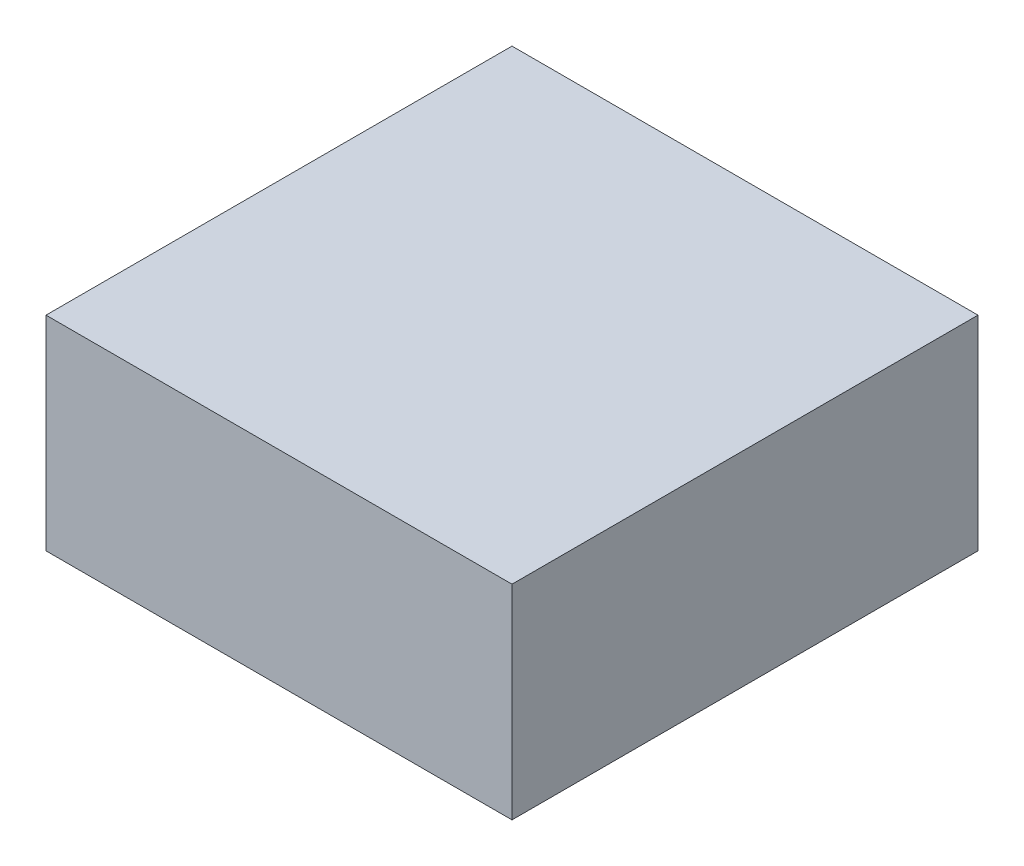
ISO-10303-21;
HEADER;
FILE_DESCRIPTION(('STEP AP214'),'2;1');
FILE_NAME('part.step','',(''),(''),'','','');
FILE_SCHEMA(('AUTOMOTIVE_DESIGN { 1 0 10303 214 1 1 1 1 }'));
ENDSEC;
DATA;
#1=APPLICATION_CONTEXT('core data for automotive mechanical design processes');
#2=APPLICATION_PROTOCOL_DEFINITION('international standard','automotive_design',2000,#1);
#3=PRODUCT_CONTEXT('',#1,'mechanical');
#4=PRODUCT('Part','Part','',(#3));
#5=PRODUCT_RELATED_PRODUCT_CATEGORY('part','',(#4));
#6=PRODUCT_DEFINITION_FORMATION('','',#4);
#7=PRODUCT_DEFINITION_CONTEXT('part definition',#1,'design');
#8=PRODUCT_DEFINITION('design','',#6,#7);
#9=PRODUCT_DEFINITION_SHAPE('','',#8);
#10=(LENGTH_UNIT() NAMED_UNIT(*) SI_UNIT(.MILLI.,.METRE.));
#11=(NAMED_UNIT(*) PLANE_ANGLE_UNIT() SI_UNIT($,.RADIAN.));
#12=(NAMED_UNIT(*) SI_UNIT($,.STERADIAN.) SOLID_ANGLE_UNIT());
#13=UNCERTAINTY_MEASURE_WITH_UNIT(LENGTH_MEASURE(1.E-05),#10,'distance_accuracy_value','');
#14=(GEOMETRIC_REPRESENTATION_CONTEXT(3) GLOBAL_UNCERTAINTY_ASSIGNED_CONTEXT((#13)) GLOBAL_UNIT_ASSIGNED_CONTEXT((#10,
#11,#12)) REPRESENTATION_CONTEXT('',''));
#15=CARTESIAN_POINT('',(0.,0.,0.));
#16=DIRECTION('',(0.,0.,1.));
#17=DIRECTION('',(1.,0.,0.));
#18=AXIS2_PLACEMENT_3D('',#15,#16,#17);
#19=CARTESIAN_POINT('',(105.,92.,-105.));
#20=DIRECTION('',(-1.,0.,0.));
#21=DIRECTION('',(0.,0.,1.));
#22=AXIS2_PLACEMENT_3D('',#19,#20,#21);
#23=PLANE('',#22);
#24=DIRECTION('',(0.,0.,-1.));
#25=VECTOR('',#24,1.);
#26=CARTESIAN_POINT('',(105.,0.,-105.));
#27=LINE('',#26,#25);
#28=CARTESIAN_POINT('',(105.,0.,105.));
#29=VERTEX_POINT('',#28);
#30=CARTESIAN_POINT('',(105.,0.,-105.));
#31=VERTEX_POINT('',#30);
#32=EDGE_CURVE('E96',#29,#31,#27,.T.);
#33=ORIENTED_EDGE('',*,*,#32,.T.);
#34=DIRECTION('',(0.,-1.,0.));
#35=VECTOR('',#34,1.);
#36=CARTESIAN_POINT('',(105.,92.,-105.));
#37=LINE('',#36,#35);
#38=CARTESIAN_POINT('',(105.,92.,-105.));
#39=VERTEX_POINT('',#38);
#40=EDGE_CURVE('E11',#39,#31,#37,.T.);
#41=ORIENTED_EDGE('',*,*,#40,.F.);
#42=DIRECTION('',(0.,0.,-1.));
#43=VECTOR('',#42,1.);
#44=CARTESIAN_POINT('',(105.,92.,-105.));
#45=LINE('',#44,#43);
#46=CARTESIAN_POINT('',(105.,92.,105.));
#47=VERTEX_POINT('',#46);
#48=EDGE_CURVE('E84',#47,#39,#45,.T.);
#49=ORIENTED_EDGE('',*,*,#48,.F.);
#50=DIRECTION('',(0.,-1.,0.));
#51=VECTOR('',#50,1.);
#52=CARTESIAN_POINT('',(105.,92.,105.));
#53=LINE('',#52,#51);
#54=EDGE_CURVE('E92',#47,#29,#53,.T.);
#55=ORIENTED_EDGE('',*,*,#54,.T.);
#56=EDGE_LOOP('',(#33,#41,#49,#55));
#57=FACE_BOUND('',#56,.T.);
#58=ADVANCED_FACE('F33',(#57),#23,.F.);
#59=CARTESIAN_POINT('',(-105.,92.,-105.));
#60=DIRECTION('',(0.,0.,1.));
#61=DIRECTION('',(1.,0.,0.));
#62=AXIS2_PLACEMENT_3D('',#59,#60,#61);
#63=PLANE('',#62);
#64=DIRECTION('',(-1.,0.,0.));
#65=VECTOR('',#64,1.);
#66=CARTESIAN_POINT('',(-105.,0.,-105.));
#67=LINE('',#66,#65);
#68=CARTESIAN_POINT('',(-105.,0.,-105.));
#69=VERTEX_POINT('',#68);
#70=EDGE_CURVE('E88',#31,#69,#67,.T.);
#71=ORIENTED_EDGE('',*,*,#70,.T.);
#72=DIRECTION('',(0.,-1.,0.));
#73=VECTOR('',#72,1.);
#74=CARTESIAN_POINT('',(-105.,92.,-105.));
#75=LINE('',#74,#73);
#76=CARTESIAN_POINT('',(-105.,92.,-105.));
#77=VERTEX_POINT('',#76);
#78=EDGE_CURVE('E41',#77,#69,#75,.T.);
#79=ORIENTED_EDGE('',*,*,#78,.F.);
#80=DIRECTION('',(-1.,0.,0.));
#81=VECTOR('',#80,1.);
#82=CARTESIAN_POINT('',(-105.,92.,-105.));
#83=LINE('',#82,#81);
#84=EDGE_CURVE('E79',#39,#77,#83,.T.);
#85=ORIENTED_EDGE('',*,*,#84,.F.);
#86=ORIENTED_EDGE('',*,*,#40,.T.);
#87=EDGE_LOOP('',(#71,#79,#85,#86));
#88=FACE_BOUND('',#87,.T.);
#89=ADVANCED_FACE('F87',(#88),#63,.F.);
#90=CARTESIAN_POINT('',(-105.,92.,-105.));
#91=DIRECTION('',(1.,0.,0.));
#92=DIRECTION('',(0.,0.,-1.));
#93=AXIS2_PLACEMENT_3D('',#90,#91,#92);
#94=PLANE('',#93);
#95=DIRECTION('',(0.,0.,1.));
#96=VECTOR('',#95,1.);
#97=CARTESIAN_POINT('',(-105.,0.,-105.));
#98=LINE('',#97,#96);
#99=CARTESIAN_POINT('',(-105.,0.,105.));
#100=VERTEX_POINT('',#99);
#101=EDGE_CURVE('E66',#69,#100,#98,.T.);
#102=ORIENTED_EDGE('',*,*,#101,.T.);
#103=DIRECTION('',(0.,-1.,0.));
#104=VECTOR('',#103,1.);
#105=CARTESIAN_POINT('',(-105.,92.,105.));
#106=LINE('',#105,#104);
#107=CARTESIAN_POINT('',(-105.,92.,105.));
#108=VERTEX_POINT('',#107);
#109=EDGE_CURVE('E89',#108,#100,#106,.T.);
#110=ORIENTED_EDGE('',*,*,#109,.F.);
#111=DIRECTION('',(0.,0.,1.));
#112=VECTOR('',#111,1.);
#113=CARTESIAN_POINT('',(-105.,92.,-105.));
#114=LINE('',#113,#112);
#115=EDGE_CURVE('E82',#77,#108,#114,.T.);
#116=ORIENTED_EDGE('',*,*,#115,.F.);
#117=ORIENTED_EDGE('',*,*,#78,.T.);
#118=EDGE_LOOP('',(#102,#110,#116,#117));
#119=FACE_BOUND('',#118,.T.);
#120=ADVANCED_FACE('F90',(#119),#94,.F.);
#121=CARTESIAN_POINT('',(-105.,92.,105.));
#122=DIRECTION('',(0.,0.,-1.));
#123=DIRECTION('',(-1.,0.,0.));
#124=AXIS2_PLACEMENT_3D('',#121,#122,#123);
#125=PLANE('',#124);
#126=DIRECTION('',(1.,0.,0.));
#127=VECTOR('',#126,1.);
#128=CARTESIAN_POINT('',(-105.,0.,105.));
#129=LINE('',#128,#127);
#130=EDGE_CURVE('E72',#100,#29,#129,.T.);
#131=ORIENTED_EDGE('',*,*,#130,.T.);
#132=ORIENTED_EDGE('',*,*,#54,.F.);
#133=DIRECTION('',(1.,0.,0.));
#134=VECTOR('',#133,1.);
#135=CARTESIAN_POINT('',(-105.,92.,105.));
#136=LINE('',#135,#134);
#137=EDGE_CURVE('E49',#108,#47,#136,.T.);
#138=ORIENTED_EDGE('',*,*,#137,.F.);
#139=ORIENTED_EDGE('',*,*,#109,.T.);
#140=EDGE_LOOP('',(#131,#132,#138,#139));
#141=FACE_BOUND('',#140,.T.);
#142=ADVANCED_FACE('F103',(#141),#125,.F.);
#143=CARTESIAN_POINT('',(0.,92.,0.));
#144=DIRECTION('',(0.,1.,0.));
#145=DIRECTION('',(0.,0.,1.));
#146=AXIS2_PLACEMENT_3D('',#143,#144,#145);
#147=PLANE('',#146);
#148=ORIENTED_EDGE('',*,*,#48,.T.);
#149=ORIENTED_EDGE('',*,*,#84,.T.);
#150=ORIENTED_EDGE('',*,*,#115,.T.);
#151=ORIENTED_EDGE('',*,*,#137,.T.);
#152=EDGE_LOOP('',(#148,#149,#150,#151));
#153=FACE_BOUND('',#152,.T.);
#154=ADVANCED_FACE('F80',(#153),#147,.T.);
#155=CARTESIAN_POINT('',(0.,0.,0.));
#156=DIRECTION('',(0.,1.,0.));
#157=DIRECTION('',(0.,0.,1.));
#158=AXIS2_PLACEMENT_3D('',#155,#156,#157);
#159=PLANE('',#158);
#160=ORIENTED_EDGE('',*,*,#32,.F.);
#161=ORIENTED_EDGE('',*,*,#130,.F.);
#162=ORIENTED_EDGE('',*,*,#101,.F.);
#163=ORIENTED_EDGE('',*,*,#70,.F.);
#164=EDGE_LOOP('',(#160,#161,#162,#163));
#165=FACE_BOUND('',#164,.T.);
#166=ADVANCED_FACE('F106',(#165),#159,.F.);
#167=CLOSED_SHELL('',(#58,#89,#120,#142,#154,#166));
#168=MANIFOLD_SOLID_BREP('B2',#167);
#169=ADVANCED_BREP_SHAPE_REPRESENTATION('',(#18,#168),#14);
#170=SHAPE_DEFINITION_REPRESENTATION(#9,#169);
ENDSEC;
END-ISO-10303-21;
